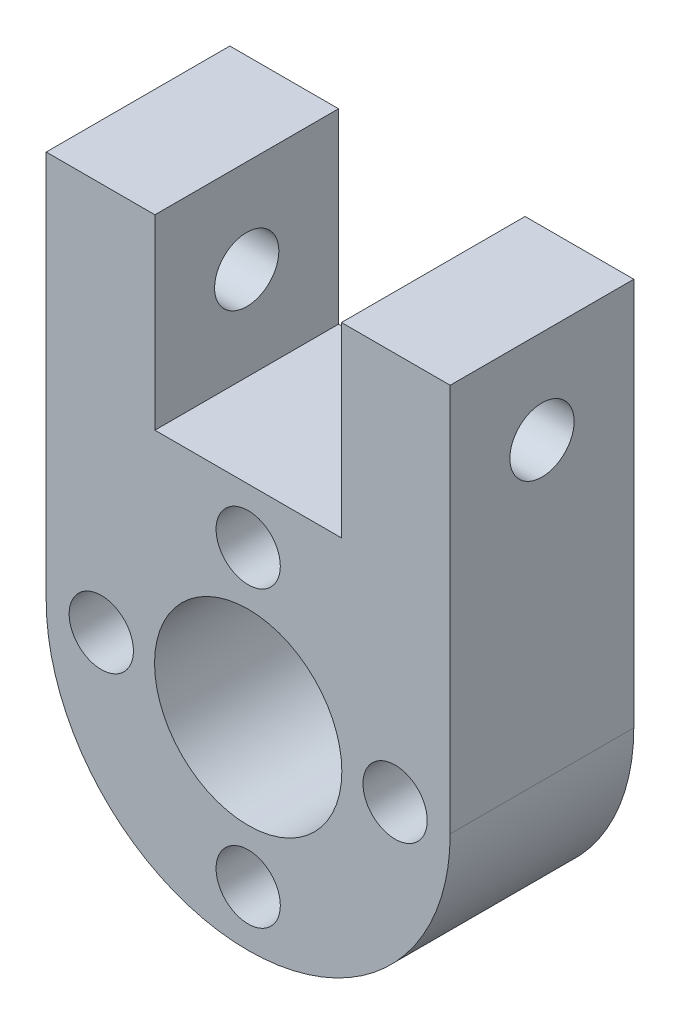
ISO-10303-21;
HEADER;
FILE_DESCRIPTION(('STEP AP214'),'2;1');
FILE_NAME('part.step','',(''),(''),'','','');
FILE_SCHEMA(('AUTOMOTIVE_DESIGN { 1 0 10303 214 1 1 1 1 }'));
ENDSEC;
DATA;
#1=APPLICATION_CONTEXT('core data for automotive mechanical design processes');
#2=APPLICATION_PROTOCOL_DEFINITION('international standard','automotive_design',2000,#1);
#3=PRODUCT_CONTEXT('',#1,'mechanical');
#4=PRODUCT('Part','Part','',(#3));
#5=PRODUCT_RELATED_PRODUCT_CATEGORY('part','',(#4));
#6=PRODUCT_DEFINITION_FORMATION('','',#4);
#7=PRODUCT_DEFINITION_CONTEXT('part definition',#1,'design');
#8=PRODUCT_DEFINITION('design','',#6,#7);
#9=PRODUCT_DEFINITION_SHAPE('','',#8);
#10=(LENGTH_UNIT() NAMED_UNIT(*) SI_UNIT(.MILLI.,.METRE.));
#11=(NAMED_UNIT(*) PLANE_ANGLE_UNIT() SI_UNIT($,.RADIAN.));
#12=(NAMED_UNIT(*) SI_UNIT($,.STERADIAN.) SOLID_ANGLE_UNIT());
#13=UNCERTAINTY_MEASURE_WITH_UNIT(LENGTH_MEASURE(1.E-05),#10,'distance_accuracy_value','');
#14=(GEOMETRIC_REPRESENTATION_CONTEXT(3) GLOBAL_UNCERTAINTY_ASSIGNED_CONTEXT((#13)) GLOBAL_UNIT_ASSIGNED_CONTEXT((#10,
#11,#12)) REPRESENTATION_CONTEXT('',''));
#15=CARTESIAN_POINT('',(0.,0.,0.));
#16=DIRECTION('',(0.,0.,1.));
#17=DIRECTION('',(1.,0.,0.));
#18=AXIS2_PLACEMENT_3D('',#15,#16,#17);
#19=CARTESIAN_POINT('',(0.,21.16,0.));
#20=DIRECTION('',(0.,-1.,0.));
#21=DIRECTION('',(0.,0.,-1.));
#22=AXIS2_PLACEMENT_3D('',#19,#20,#21);
#23=PLANE('',#22);
#24=DIRECTION('',(1.,0.,0.));
#25=VECTOR('',#24,1.);
#26=CARTESIAN_POINT('',(-11.,21.16,10.));
#27=LINE('',#26,#25);
#28=CARTESIAN_POINT('',(-11.,21.16,10.));
#29=VERTEX_POINT('',#28);
#30=CARTESIAN_POINT('',(-5.08,21.16,10.));
#31=VERTEX_POINT('',#30);
#32=EDGE_CURVE('E189',#29,#31,#27,.T.);
#33=ORIENTED_EDGE('',*,*,#32,.T.);
#34=DIRECTION('',(0.,0.,1.));
#35=VECTOR('',#34,1.);
#36=CARTESIAN_POINT('',(-5.08,21.16,0.));
#37=LINE('',#36,#35);
#38=CARTESIAN_POINT('',(-5.08,21.16,0.));
#39=VERTEX_POINT('',#38);
#40=EDGE_CURVE('E177',#39,#31,#37,.T.);
#41=ORIENTED_EDGE('',*,*,#40,.F.);
#42=DIRECTION('',(1.,0.,0.));
#43=VECTOR('',#42,1.);
#44=CARTESIAN_POINT('',(-11.,21.16,0.));
#45=LINE('',#44,#43);
#46=CARTESIAN_POINT('',(-11.,21.16,0.));
#47=VERTEX_POINT('',#46);
#48=EDGE_CURVE('E161',#47,#39,#45,.T.);
#49=ORIENTED_EDGE('',*,*,#48,.F.);
#50=DIRECTION('',(0.,0.,1.));
#51=VECTOR('',#50,1.);
#52=CARTESIAN_POINT('',(-11.,21.16,0.));
#53=LINE('',#52,#51);
#54=EDGE_CURVE('E199',#47,#29,#53,.T.);
#55=ORIENTED_EDGE('',*,*,#54,.T.);
#56=EDGE_LOOP('',(#33,#41,#49,#55));
#57=FACE_BOUND('',#56,.T.);
#58=ADVANCED_FACE('F49',(#57),#23,.F.);
#59=CARTESIAN_POINT('',(0.,0.,10.));
#60=DIRECTION('',(0.,0.,-1.));
#61=DIRECTION('',(-1.,0.,0.));
#62=AXIS2_PLACEMENT_3D('',#59,#60,#61);
#63=CYLINDRICAL_SURFACE('',#62,11.);
#64=DIRECTION('',(0.,0.,-1.));
#65=VECTOR('',#64,1.);
#66=CARTESIAN_POINT('',(11.,0.,10.));
#67=LINE('',#66,#65);
#68=CARTESIAN_POINT('',(11.,0.,0.));
#69=VERTEX_POINT('',#68);
#70=CARTESIAN_POINT('',(11.,0.,10.));
#71=VERTEX_POINT('',#70);
#72=EDGE_CURVE('E180',#69,#71,#67,.F.);
#73=ORIENTED_EDGE('',*,*,#72,.T.);
#74=CARTESIAN_POINT('',(0.,0.,10.));
#75=DIRECTION('',(0.,0.,1.));
#76=DIRECTION('',(1.,0.,0.));
#77=AXIS2_PLACEMENT_3D('',#74,#75,#76);
#78=CIRCLE('',#77,11.);
#79=CARTESIAN_POINT('',(-11.,0.,10.));
#80=VERTEX_POINT('',#79);
#81=EDGE_CURVE('E11',#80,#71,#78,.T.);
#82=ORIENTED_EDGE('',*,*,#81,.F.);
#83=DIRECTION('',(0.,0.,-1.));
#84=VECTOR('',#83,1.);
#85=CARTESIAN_POINT('',(-11.,0.,10.));
#86=LINE('',#85,#84);
#87=CARTESIAN_POINT('',(-11.,0.,0.));
#88=VERTEX_POINT('',#87);
#89=EDGE_CURVE('E209',#88,#80,#86,.F.);
#90=ORIENTED_EDGE('',*,*,#89,.F.);
#91=CARTESIAN_POINT('',(0.,0.,0.));
#92=DIRECTION('',(0.,0.,1.));
#93=DIRECTION('',(1.,0.,0.));
#94=AXIS2_PLACEMENT_3D('',#91,#92,#93);
#95=CIRCLE('',#94,11.);
#96=EDGE_CURVE('E59',#88,#69,#95,.T.);
#97=ORIENTED_EDGE('',*,*,#96,.T.);
#98=EDGE_LOOP('',(#73,#82,#90,#97));
#99=FACE_BOUND('',#98,.T.);
#100=ADVANCED_FACE('F51',(#99),#63,.T.);
#101=CARTESIAN_POINT('',(0.,0.,10.));
#102=DIRECTION('',(0.,0.,1.));
#103=DIRECTION('',(1.,0.,0.));
#104=AXIS2_PLACEMENT_3D('',#101,#102,#103);
#105=PLANE('',#104);
#106=DIRECTION('',(0.,-1.,0.));
#107=VECTOR('',#106,1.);
#108=CARTESIAN_POINT('',(-5.08,21.16,10.));
#109=LINE('',#108,#107);
#110=CARTESIAN_POINT('',(-5.08,11.,10.));
#111=VERTEX_POINT('',#110);
#112=EDGE_CURVE('E141',#31,#111,#109,.T.);
#113=ORIENTED_EDGE('',*,*,#112,.F.);
#114=ORIENTED_EDGE('',*,*,#32,.F.);
#115=DIRECTION('',(0.,1.,0.));
#116=VECTOR('',#115,1.);
#117=CARTESIAN_POINT('',(-11.,-11.001,10.));
#118=LINE('',#117,#116);
#119=EDGE_CURVE('E213',#80,#29,#118,.T.);
#120=ORIENTED_EDGE('',*,*,#119,.F.);
#121=ORIENTED_EDGE('',*,*,#81,.T.);
#122=DIRECTION('',(0.,-1.,0.));
#123=VECTOR('',#122,1.);
#124=CARTESIAN_POINT('',(11.,21.16,10.));
#125=LINE('',#124,#123);
#126=CARTESIAN_POINT('',(11.,21.16,10.));
#127=VERTEX_POINT('',#126);
#128=EDGE_CURVE('E81',#127,#71,#125,.T.);
#129=ORIENTED_EDGE('',*,*,#128,.F.);
#130=CARTESIAN_POINT('',(5.08,21.16,10.));
#131=VERTEX_POINT('',#130);
#132=EDGE_CURVE('E188',#131,#127,#27,.T.);
#133=ORIENTED_EDGE('',*,*,#132,.F.);
#134=DIRECTION('',(0.,1.,0.));
#135=VECTOR('',#134,1.);
#136=CARTESIAN_POINT('',(5.08,21.16,10.));
#137=LINE('',#136,#135);
#138=CARTESIAN_POINT('',(5.08,11.,10.));
#139=VERTEX_POINT('',#138);
#140=EDGE_CURVE('E70',#139,#131,#137,.T.);
#141=ORIENTED_EDGE('',*,*,#140,.F.);
#142=DIRECTION('',(1.,0.,0.));
#143=VECTOR('',#142,1.);
#144=CARTESIAN_POINT('',(-5.08,11.,10.));
#145=LINE('',#144,#143);
#146=EDGE_CURVE('E165',#111,#139,#145,.T.);
#147=ORIENTED_EDGE('',*,*,#146,.F.);
#148=EDGE_LOOP('',(#113,#114,#120,#121,#129,#133,#141,#147));
#149=FACE_BOUND('',#148,.T.);
#150=CARTESIAN_POINT('',(0.,8.,10.));
#151=DIRECTION('',(0.,0.,1.));
#152=DIRECTION('',(1.,0.,0.));
#153=AXIS2_PLACEMENT_3D('',#150,#151,#152);
#154=CIRCLE('',#153,1.75);
#155=CARTESIAN_POINT('',(1.75,8.,10.));
#156=VERTEX_POINT('',#155);
#157=EDGE_CURVE('E223',#156,#156,#154,.T.);
#158=ORIENTED_EDGE('',*,*,#157,.F.);
#159=EDGE_LOOP('',(#158));
#160=FACE_BOUND('',#159,.T.);
#161=CARTESIAN_POINT('',(-8.,0.,10.));
#162=DIRECTION('',(0.,0.,1.));
#163=DIRECTION('',(1.,0.,0.));
#164=AXIS2_PLACEMENT_3D('',#161,#162,#163);
#165=CIRCLE('',#164,1.75);
#166=CARTESIAN_POINT('',(-6.25,0.,10.));
#167=VERTEX_POINT('',#166);
#168=EDGE_CURVE('E227',#167,#167,#165,.T.);
#169=ORIENTED_EDGE('',*,*,#168,.F.);
#170=EDGE_LOOP('',(#169));
#171=FACE_BOUND('',#170,.T.);
#172=CARTESIAN_POINT('',(8.,0.,10.));
#173=DIRECTION('',(0.,0.,1.));
#174=DIRECTION('',(1.,0.,0.));
#175=AXIS2_PLACEMENT_3D('',#172,#173,#174);
#176=CIRCLE('',#175,1.75);
#177=CARTESIAN_POINT('',(9.75,0.,10.));
#178=VERTEX_POINT('',#177);
#179=EDGE_CURVE('E235',#178,#178,#176,.T.);
#180=ORIENTED_EDGE('',*,*,#179,.F.);
#181=EDGE_LOOP('',(#180));
#182=FACE_BOUND('',#181,.T.);
#183=CARTESIAN_POINT('',(0.,-8.,10.));
#184=DIRECTION('',(0.,0.,1.));
#185=DIRECTION('',(1.,0.,0.));
#186=AXIS2_PLACEMENT_3D('',#183,#184,#185);
#187=CIRCLE('',#186,1.75);
#188=CARTESIAN_POINT('',(1.74999999999994,-8.,10.));
#189=VERTEX_POINT('',#188);
#190=EDGE_CURVE('E243',#189,#189,#187,.T.);
#191=ORIENTED_EDGE('',*,*,#190,.F.);
#192=EDGE_LOOP('',(#191));
#193=FACE_BOUND('',#192,.T.);
#194=CARTESIAN_POINT('',(0.,0.,10.));
#195=DIRECTION('',(0.,0.,1.));
#196=DIRECTION('',(1.,0.,0.));
#197=AXIS2_PLACEMENT_3D('',#194,#195,#196);
#198=CIRCLE('',#197,5.1);
#199=CARTESIAN_POINT('',(5.1,0.,10.));
#200=VERTEX_POINT('',#199);
#201=EDGE_CURVE('E250',#200,#200,#198,.T.);
#202=ORIENTED_EDGE('',*,*,#201,.F.);
#203=EDGE_LOOP('',(#202));
#204=FACE_BOUND('',#203,.T.);
#205=ADVANCED_FACE('F271',(#149,#160,#171,#182,#193,#204),#105,.T.);
#206=CARTESIAN_POINT('',(0.,0.,0.));
#207=DIRECTION('',(0.,0.,1.));
#208=DIRECTION('',(1.,0.,0.));
#209=AXIS2_PLACEMENT_3D('',#206,#207,#208);
#210=PLANE('',#209);
#211=ORIENTED_EDGE('',*,*,#48,.T.);
#212=DIRECTION('',(0.,-1.,0.));
#213=VECTOR('',#212,1.);
#214=CARTESIAN_POINT('',(-5.08,21.16,0.));
#215=LINE('',#214,#213);
#216=CARTESIAN_POINT('',(-5.08,11.,0.));
#217=VERTEX_POINT('',#216);
#218=EDGE_CURVE('E138',#39,#217,#215,.T.);
#219=ORIENTED_EDGE('',*,*,#218,.T.);
#220=DIRECTION('',(1.,0.,0.));
#221=VECTOR('',#220,1.);
#222=CARTESIAN_POINT('',(-5.08,11.,0.));
#223=LINE('',#222,#221);
#224=CARTESIAN_POINT('',(5.08,11.,0.));
#225=VERTEX_POINT('',#224);
#226=EDGE_CURVE('E150',#217,#225,#223,.T.);
#227=ORIENTED_EDGE('',*,*,#226,.T.);
#228=DIRECTION('',(0.,1.,0.));
#229=VECTOR('',#228,1.);
#230=CARTESIAN_POINT('',(5.08,21.16,0.));
#231=LINE('',#230,#229);
#232=CARTESIAN_POINT('',(5.08,21.16,0.));
#233=VERTEX_POINT('',#232);
#234=EDGE_CURVE('E147',#225,#233,#231,.T.);
#235=ORIENTED_EDGE('',*,*,#234,.T.);
#236=CARTESIAN_POINT('',(11.,21.16,0.));
#237=VERTEX_POINT('',#236);
#238=EDGE_CURVE('E196',#233,#237,#45,.T.);
#239=ORIENTED_EDGE('',*,*,#238,.T.);
#240=DIRECTION('',(0.,-1.,0.));
#241=VECTOR('',#240,1.);
#242=CARTESIAN_POINT('',(11.,21.16,0.));
#243=LINE('',#242,#241);
#244=EDGE_CURVE('E203',#237,#69,#243,.T.);
#245=ORIENTED_EDGE('',*,*,#244,.T.);
#246=ORIENTED_EDGE('',*,*,#96,.F.);
#247=DIRECTION('',(0.,1.,0.));
#248=VECTOR('',#247,1.);
#249=CARTESIAN_POINT('',(-11.,-11.001,0.));
#250=LINE('',#249,#248);
#251=EDGE_CURVE('E208',#88,#47,#250,.T.);
#252=ORIENTED_EDGE('',*,*,#251,.T.);
#253=EDGE_LOOP('',(#211,#219,#227,#235,#239,#245,#246,#252));
#254=FACE_BOUND('',#253,.T.);
#255=CARTESIAN_POINT('',(0.,8.,0.));
#256=DIRECTION('',(0.,0.,1.));
#257=DIRECTION('',(1.,0.,0.));
#258=AXIS2_PLACEMENT_3D('',#255,#256,#257);
#259=CIRCLE('',#258,1.75);
#260=CARTESIAN_POINT('',(1.75,8.,0.));
#261=VERTEX_POINT('',#260);
#262=EDGE_CURVE('E218',#261,#261,#259,.T.);
#263=ORIENTED_EDGE('',*,*,#262,.T.);
#264=EDGE_LOOP('',(#263));
#265=FACE_BOUND('',#264,.T.);
#266=CARTESIAN_POINT('',(-8.,0.,0.));
#267=DIRECTION('',(0.,0.,1.));
#268=DIRECTION('',(1.,0.,0.));
#269=AXIS2_PLACEMENT_3D('',#266,#267,#268);
#270=CIRCLE('',#269,1.75);
#271=CARTESIAN_POINT('',(-6.25,0.,0.));
#272=VERTEX_POINT('',#271);
#273=EDGE_CURVE('E231',#272,#272,#270,.T.);
#274=ORIENTED_EDGE('',*,*,#273,.T.);
#275=EDGE_LOOP('',(#274));
#276=FACE_BOUND('',#275,.T.);
#277=CARTESIAN_POINT('',(8.,0.,0.));
#278=DIRECTION('',(0.,0.,1.));
#279=DIRECTION('',(1.,0.,0.));
#280=AXIS2_PLACEMENT_3D('',#277,#278,#279);
#281=CIRCLE('',#280,1.75);
#282=CARTESIAN_POINT('',(9.75,0.,0.));
#283=VERTEX_POINT('',#282);
#284=EDGE_CURVE('E239',#283,#283,#281,.T.);
#285=ORIENTED_EDGE('',*,*,#284,.T.);
#286=EDGE_LOOP('',(#285));
#287=FACE_BOUND('',#286,.T.);
#288=CARTESIAN_POINT('',(0.,-8.,0.));
#289=DIRECTION('',(0.,0.,1.));
#290=DIRECTION('',(1.,0.,0.));
#291=AXIS2_PLACEMENT_3D('',#288,#289,#290);
#292=CIRCLE('',#291,1.75);
#293=CARTESIAN_POINT('',(1.74999999999994,-8.,0.));
#294=VERTEX_POINT('',#293);
#295=EDGE_CURVE('E212',#294,#294,#292,.T.);
#296=ORIENTED_EDGE('',*,*,#295,.T.);
#297=EDGE_LOOP('',(#296));
#298=FACE_BOUND('',#297,.T.);
#299=CARTESIAN_POINT('',(0.,0.,0.));
#300=DIRECTION('',(0.,0.,1.));
#301=DIRECTION('',(1.,0.,0.));
#302=AXIS2_PLACEMENT_3D('',#299,#300,#301);
#303=CIRCLE('',#302,5.1);
#304=CARTESIAN_POINT('',(5.1,0.,0.));
#305=VERTEX_POINT('',#304);
#306=EDGE_CURVE('E222',#305,#305,#303,.T.);
#307=ORIENTED_EDGE('',*,*,#306,.T.);
#308=EDGE_LOOP('',(#307));
#309=FACE_BOUND('',#308,.T.);
#310=ADVANCED_FACE('F158',(#254,#265,#276,#287,#298,#309),#210,.F.);
#311=CARTESIAN_POINT('',(0.,0.,10.));
#312=DIRECTION('',(0.,0.,-1.));
#313=DIRECTION('',(-1.,0.,0.));
#314=AXIS2_PLACEMENT_3D('',#311,#312,#313);
#315=CYLINDRICAL_SURFACE('',#314,5.1);
#316=ORIENTED_EDGE('',*,*,#201,.T.);
#317=EDGE_LOOP('',(#316));
#318=FACE_BOUND('',#317,.T.);
#319=ORIENTED_EDGE('',*,*,#306,.F.);
#320=EDGE_LOOP('',(#319));
#321=FACE_BOUND('',#320,.T.);
#322=ADVANCED_FACE('F314',(#318,#321),#315,.F.);
#323=CARTESIAN_POINT('',(0.,-8.,0.));
#324=DIRECTION('',(0.,0.,1.));
#325=DIRECTION('',(1.,0.,0.));
#326=AXIS2_PLACEMENT_3D('',#323,#324,#325);
#327=CYLINDRICAL_SURFACE('',#326,1.75);
#328=ORIENTED_EDGE('',*,*,#295,.F.);
#329=EDGE_LOOP('',(#328));
#330=FACE_BOUND('',#329,.T.);
#331=ORIENTED_EDGE('',*,*,#190,.T.);
#332=EDGE_LOOP('',(#331));
#333=FACE_BOUND('',#332,.T.);
#334=ADVANCED_FACE('F310',(#330,#333),#327,.F.);
#335=CARTESIAN_POINT('',(8.,0.,0.));
#336=DIRECTION('',(0.,0.,1.));
#337=DIRECTION('',(1.,0.,0.));
#338=AXIS2_PLACEMENT_3D('',#335,#336,#337);
#339=CYLINDRICAL_SURFACE('',#338,1.75);
#340=ORIENTED_EDGE('',*,*,#284,.F.);
#341=EDGE_LOOP('',(#340));
#342=FACE_BOUND('',#341,.T.);
#343=ORIENTED_EDGE('',*,*,#179,.T.);
#344=EDGE_LOOP('',(#343));
#345=FACE_BOUND('',#344,.T.);
#346=ADVANCED_FACE('F306',(#342,#345),#339,.F.);
#347=CARTESIAN_POINT('',(-8.,0.,0.));
#348=DIRECTION('',(0.,0.,1.));
#349=DIRECTION('',(1.,0.,0.));
#350=AXIS2_PLACEMENT_3D('',#347,#348,#349);
#351=CYLINDRICAL_SURFACE('',#350,1.75);
#352=ORIENTED_EDGE('',*,*,#273,.F.);
#353=EDGE_LOOP('',(#352));
#354=FACE_BOUND('',#353,.T.);
#355=ORIENTED_EDGE('',*,*,#168,.T.);
#356=EDGE_LOOP('',(#355));
#357=FACE_BOUND('',#356,.T.);
#358=ADVANCED_FACE('F302',(#354,#357),#351,.F.);
#359=CARTESIAN_POINT('',(0.,8.,0.));
#360=DIRECTION('',(0.,0.,1.));
#361=DIRECTION('',(1.,0.,0.));
#362=AXIS2_PLACEMENT_3D('',#359,#360,#361);
#363=CYLINDRICAL_SURFACE('',#362,1.75);
#364=ORIENTED_EDGE('',*,*,#262,.F.);
#365=EDGE_LOOP('',(#364));
#366=FACE_BOUND('',#365,.T.);
#367=ORIENTED_EDGE('',*,*,#157,.T.);
#368=EDGE_LOOP('',(#367));
#369=FACE_BOUND('',#368,.T.);
#370=ADVANCED_FACE('F295',(#366,#369),#363,.F.);
#371=CARTESIAN_POINT('',(-11.,-11.001,10.));
#372=DIRECTION('',(1.,0.,0.));
#373=DIRECTION('',(0.,0.,-1.));
#374=AXIS2_PLACEMENT_3D('',#371,#372,#373);
#375=PLANE('',#374);
#376=CARTESIAN_POINT('',(-11.,16.08,5.));
#377=DIRECTION('',(1.,0.,0.));
#378=DIRECTION('',(0.,0.,-1.));
#379=AXIS2_PLACEMENT_3D('',#376,#377,#378);
#380=CIRCLE('',#379,1.75);
#381=CARTESIAN_POINT('',(-11.,16.08,3.25));
#382=VERTEX_POINT('',#381);
#383=EDGE_CURVE('E474',#382,#382,#380,.T.);
#384=ORIENTED_EDGE('',*,*,#383,.T.);
#385=EDGE_LOOP('',(#384));
#386=FACE_BOUND('',#385,.T.);
#387=ORIENTED_EDGE('',*,*,#251,.F.);
#388=ORIENTED_EDGE('',*,*,#89,.T.);
#389=ORIENTED_EDGE('',*,*,#119,.T.);
#390=ORIENTED_EDGE('',*,*,#54,.F.);
#391=EDGE_LOOP('',(#387,#388,#389,#390));
#392=FACE_BOUND('',#391,.T.);
#393=ADVANCED_FACE('F277',(#386,#392),#375,.F.);
#394=CARTESIAN_POINT('',(11.,21.16,0.));
#395=DIRECTION('',(1.,0.,0.));
#396=DIRECTION('',(0.,0.,-1.));
#397=AXIS2_PLACEMENT_3D('',#394,#395,#396);
#398=PLANE('',#397);
#399=CARTESIAN_POINT('',(11.,16.08,5.));
#400=DIRECTION('',(1.,0.,0.));
#401=DIRECTION('',(0.,0.,-1.));
#402=AXIS2_PLACEMENT_3D('',#399,#400,#401);
#403=CIRCLE('',#402,1.75);
#404=CARTESIAN_POINT('',(11.,16.08,3.25));
#405=VERTEX_POINT('',#404);
#406=EDGE_CURVE('E482',#405,#405,#403,.T.);
#407=ORIENTED_EDGE('',*,*,#406,.F.);
#408=EDGE_LOOP('',(#407));
#409=FACE_BOUND('',#408,.T.);
#410=ORIENTED_EDGE('',*,*,#128,.T.);
#411=ORIENTED_EDGE('',*,*,#72,.F.);
#412=ORIENTED_EDGE('',*,*,#244,.F.);
#413=DIRECTION('',(0.,0.,1.));
#414=VECTOR('',#413,1.);
#415=CARTESIAN_POINT('',(11.,21.16,0.));
#416=LINE('',#415,#414);
#417=EDGE_CURVE('E193',#237,#127,#416,.T.);
#418=ORIENTED_EDGE('',*,*,#417,.T.);
#419=EDGE_LOOP('',(#410,#411,#412,#418));
#420=FACE_BOUND('',#419,.T.);
#421=ADVANCED_FACE('F263',(#409,#420),#398,.T.);
#422=ORIENTED_EDGE('',*,*,#238,.F.);
#423=DIRECTION('',(0.,0.,1.));
#424=VECTOR('',#423,1.);
#425=CARTESIAN_POINT('',(5.08,21.16,0.));
#426=LINE('',#425,#424);
#427=EDGE_CURVE('E181',#233,#131,#426,.T.);
#428=ORIENTED_EDGE('',*,*,#427,.T.);
#429=ORIENTED_EDGE('',*,*,#132,.T.);
#430=ORIENTED_EDGE('',*,*,#417,.F.);
#431=EDGE_LOOP('',(#422,#428,#429,#430));
#432=FACE_BOUND('',#431,.T.);
#433=ADVANCED_FACE('F267',(#432),#23,.F.);
#434=CARTESIAN_POINT('',(-5.08,21.16,0.));
#435=DIRECTION('',(-1.,0.,0.));
#436=DIRECTION('',(0.,-1.,0.));
#437=AXIS2_PLACEMENT_3D('',#434,#435,#436);
#438=PLANE('',#437);
#439=CARTESIAN_POINT('',(-5.08,16.08,5.));
#440=DIRECTION('',(-1.,0.,0.));
#441=DIRECTION('',(0.,-1.,0.));
#442=AXIS2_PLACEMENT_3D('',#439,#440,#441);
#443=CIRCLE('',#442,1.75);
#444=CARTESIAN_POINT('',(-5.08,14.33,5.));
#445=VERTEX_POINT('',#444);
#446=EDGE_CURVE('E168',#445,#445,#443,.T.);
#447=ORIENTED_EDGE('',*,*,#446,.T.);
#448=EDGE_LOOP('',(#447));
#449=FACE_BOUND('',#448,.T.);
#450=ORIENTED_EDGE('',*,*,#112,.T.);
#451=DIRECTION('',(0.,0.,1.));
#452=VECTOR('',#451,1.);
#453=CARTESIAN_POINT('',(-5.08,11.,0.));
#454=LINE('',#453,#452);
#455=EDGE_CURVE('E134',#217,#111,#454,.T.);
#456=ORIENTED_EDGE('',*,*,#455,.F.);
#457=ORIENTED_EDGE('',*,*,#218,.F.);
#458=ORIENTED_EDGE('',*,*,#40,.T.);
#459=EDGE_LOOP('',(#450,#456,#457,#458));
#460=FACE_BOUND('',#459,.T.);
#461=ADVANCED_FACE('F136',(#449,#460),#438,.F.);
#462=CARTESIAN_POINT('',(5.08,21.16,0.));
#463=DIRECTION('',(1.,0.,0.));
#464=DIRECTION('',(0.,0.,-1.));
#465=AXIS2_PLACEMENT_3D('',#462,#463,#464);
#466=PLANE('',#465);
#467=CARTESIAN_POINT('',(5.08,16.08,5.));
#468=DIRECTION('',(1.,0.,0.));
#469=DIRECTION('',(0.,0.,-1.));
#470=AXIS2_PLACEMENT_3D('',#467,#468,#469);
#471=CIRCLE('',#470,1.75);
#472=CARTESIAN_POINT('',(5.08,16.08,3.25));
#473=VERTEX_POINT('',#472);
#474=EDGE_CURVE('E53',#473,#473,#471,.T.);
#475=ORIENTED_EDGE('',*,*,#474,.T.);
#476=EDGE_LOOP('',(#475));
#477=FACE_BOUND('',#476,.T.);
#478=ORIENTED_EDGE('',*,*,#140,.T.);
#479=ORIENTED_EDGE('',*,*,#427,.F.);
#480=ORIENTED_EDGE('',*,*,#234,.F.);
#481=DIRECTION('',(0.,0.,1.));
#482=VECTOR('',#481,1.);
#483=CARTESIAN_POINT('',(5.08,11.,0.));
#484=LINE('',#483,#482);
#485=EDGE_CURVE('E146',#225,#139,#484,.T.);
#486=ORIENTED_EDGE('',*,*,#485,.T.);
#487=EDGE_LOOP('',(#478,#479,#480,#486));
#488=FACE_BOUND('',#487,.T.);
#489=ADVANCED_FACE('F290',(#477,#488),#466,.F.);
#490=CARTESIAN_POINT('',(-5.08,11.,0.));
#491=DIRECTION('',(0.,-1.,0.));
#492=DIRECTION('',(1.,0.,0.));
#493=AXIS2_PLACEMENT_3D('',#490,#491,#492);
#494=PLANE('',#493);
#495=ORIENTED_EDGE('',*,*,#146,.T.);
#496=ORIENTED_EDGE('',*,*,#485,.F.);
#497=ORIENTED_EDGE('',*,*,#226,.F.);
#498=ORIENTED_EDGE('',*,*,#455,.T.);
#499=EDGE_LOOP('',(#495,#496,#497,#498));
#500=FACE_BOUND('',#499,.T.);
#501=ADVANCED_FACE('F151',(#500),#494,.F.);
#502=CARTESIAN_POINT('',(-11.,16.08,5.));
#503=DIRECTION('',(1.,0.,0.));
#504=DIRECTION('',(0.,0.,-1.));
#505=AXIS2_PLACEMENT_3D('',#502,#503,#504);
#506=CYLINDRICAL_SURFACE('',#505,1.75);
#507=ORIENTED_EDGE('',*,*,#406,.T.);
#508=EDGE_LOOP('',(#507));
#509=FACE_BOUND('',#508,.T.);
#510=ORIENTED_EDGE('',*,*,#474,.F.);
#511=EDGE_LOOP('',(#510));
#512=FACE_BOUND('',#511,.T.);
#513=ADVANCED_FACE('F357',(#509,#512),#506,.F.);
#514=ORIENTED_EDGE('',*,*,#383,.F.);
#515=EDGE_LOOP('',(#514));
#516=FACE_BOUND('',#515,.T.);
#517=ORIENTED_EDGE('',*,*,#446,.F.);
#518=EDGE_LOOP('',(#517));
#519=FACE_BOUND('',#518,.T.);
#520=ADVANCED_FACE('F362',(#516,#519),#506,.F.);
#521=CLOSED_SHELL('',(#58,#100,#205,#310,#322,#334,#346,#358,#370,#393,#421,#433,#461,#489,#501,
#513,#520));
#522=MANIFOLD_SOLID_BREP('B2',#521);
#523=ADVANCED_BREP_SHAPE_REPRESENTATION('',(#18,#522),#14);
#524=SHAPE_DEFINITION_REPRESENTATION(#9,#523);
ENDSEC;
END-ISO-10303-21;
